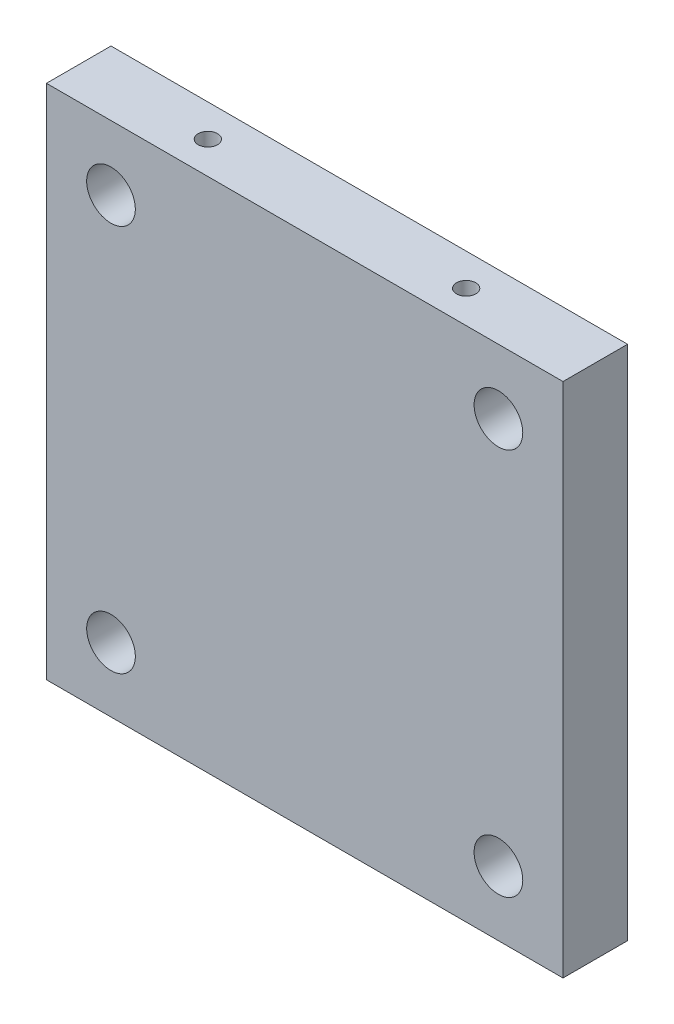
ISO-10303-21;
HEADER;
FILE_DESCRIPTION(('STEP AP214'),'2;1');
FILE_NAME('part.step','',(''),(''),'','','');
FILE_SCHEMA(('AUTOMOTIVE_DESIGN { 1 0 10303 214 1 1 1 1 }'));
ENDSEC;
DATA;
#1=APPLICATION_CONTEXT('core data for automotive mechanical design processes');
#2=APPLICATION_PROTOCOL_DEFINITION('international standard','automotive_design',2000,#1);
#3=PRODUCT_CONTEXT('',#1,'mechanical');
#4=PRODUCT('Part','Part','',(#3));
#5=PRODUCT_RELATED_PRODUCT_CATEGORY('part','',(#4));
#6=PRODUCT_DEFINITION_FORMATION('','',#4);
#7=PRODUCT_DEFINITION_CONTEXT('part definition',#1,'design');
#8=PRODUCT_DEFINITION('design','',#6,#7);
#9=PRODUCT_DEFINITION_SHAPE('','',#8);
#10=(LENGTH_UNIT() NAMED_UNIT(*) SI_UNIT(.MILLI.,.METRE.));
#11=(NAMED_UNIT(*) PLANE_ANGLE_UNIT() SI_UNIT($,.RADIAN.));
#12=(NAMED_UNIT(*) SI_UNIT($,.STERADIAN.) SOLID_ANGLE_UNIT());
#13=UNCERTAINTY_MEASURE_WITH_UNIT(LENGTH_MEASURE(1.E-05),#10,'distance_accuracy_value','');
#14=(GEOMETRIC_REPRESENTATION_CONTEXT(3) GLOBAL_UNCERTAINTY_ASSIGNED_CONTEXT((#13)) GLOBAL_UNIT_ASSIGNED_CONTEXT((#10,
#11,#12)) REPRESENTATION_CONTEXT('',''));
#15=CARTESIAN_POINT('',(0.,0.,0.));
#16=DIRECTION('',(0.,0.,1.));
#17=DIRECTION('',(1.,0.,0.));
#18=AXIS2_PLACEMENT_3D('',#15,#16,#17);
#19=CARTESIAN_POINT('',(-25.4,-38.1,6.35));
#20=DIRECTION('',(0.,-1.,0.));
#21=DIRECTION('',(0.,0.,-1.));
#22=AXIS2_PLACEMENT_3D('',#19,#20,#21);
#23=CONICAL_SURFACE('',#22,1.89864999999999,1.02974425867665);
#24=CARTESIAN_POINT('',(-25.4,-38.1,6.35));
#25=DIRECTION('',(0.,1.,0.));
#26=DIRECTION('',(0.,0.,1.));
#27=AXIS2_PLACEMENT_3D('',#24,#25,#26);
#28=CIRCLE('',#27,1.89865);
#29=CARTESIAN_POINT('',(-25.4,-38.1,8.24865));
#30=VERTEX_POINT('',#29);
#31=EDGE_CURVE('E155',#30,#30,#28,.F.);
#32=ORIENTED_EDGE('',*,*,#31,.T.);
#33=EDGE_LOOP('',(#32));
#34=FACE_BOUND('',#33,.T.);
#35=CARTESIAN_POINT('',(-25.4,-36.9591759856833,6.35));
#36=VERTEX_POINT('',#35);
#37=VERTEX_LOOP('',#36);
#38=FACE_BOUND('',#37,.T.);
#39=ADVANCED_FACE('F16',(#34,#38),#23,.F.);
#40=CARTESIAN_POINT('',(25.4,-38.1,6.35));
#41=DIRECTION('',(0.,-1.,0.));
#42=DIRECTION('',(0.,0.,-1.));
#43=AXIS2_PLACEMENT_3D('',#40,#41,#42);
#44=CONICAL_SURFACE('',#43,1.89865,1.02974425867665);
#45=CARTESIAN_POINT('',(25.4,-36.9591759856833,6.35));
#46=VERTEX_POINT('',#45);
#47=VERTEX_LOOP('',#46);
#48=FACE_BOUND('',#47,.T.);
#49=CARTESIAN_POINT('',(25.4,-38.1,6.35));
#50=DIRECTION('',(0.,-1.,0.));
#51=DIRECTION('',(0.,0.,-1.));
#52=AXIS2_PLACEMENT_3D('',#49,#50,#51);
#53=CIRCLE('',#52,1.89865);
#54=CARTESIAN_POINT('',(25.4,-38.1,4.45135));
#55=VERTEX_POINT('',#54);
#56=EDGE_CURVE('E149',#55,#55,#53,.T.);
#57=ORIENTED_EDGE('',*,*,#56,.T.);
#58=EDGE_LOOP('',(#57));
#59=FACE_BOUND('',#58,.T.);
#60=ADVANCED_FACE('F67',(#48,#59),#44,.F.);
#61=CARTESIAN_POINT('',(-25.4,38.1,6.35));
#62=DIRECTION('',(0.,1.,0.));
#63=DIRECTION('',(0.,0.,1.));
#64=AXIS2_PLACEMENT_3D('',#61,#62,#63);
#65=CONICAL_SURFACE('',#64,1.89865,1.02974425867665);
#66=CARTESIAN_POINT('',(-25.4,36.9591759856833,6.35));
#67=VERTEX_POINT('',#66);
#68=VERTEX_LOOP('',#67);
#69=FACE_BOUND('',#68,.T.);
#70=CARTESIAN_POINT('',(-25.4,38.1,6.35));
#71=DIRECTION('',(0.,1.,0.));
#72=DIRECTION('',(0.,0.,1.));
#73=AXIS2_PLACEMENT_3D('',#70,#71,#72);
#74=CIRCLE('',#73,1.89865);
#75=CARTESIAN_POINT('',(-25.4,38.1,8.24865));
#76=VERTEX_POINT('',#75);
#77=EDGE_CURVE('E147',#76,#76,#74,.T.);
#78=ORIENTED_EDGE('',*,*,#77,.T.);
#79=EDGE_LOOP('',(#78));
#80=FACE_BOUND('',#79,.T.);
#81=ADVANCED_FACE('F73',(#69,#80),#65,.F.);
#82=CARTESIAN_POINT('',(25.4,38.1,6.35));
#83=DIRECTION('',(0.,1.,0.));
#84=DIRECTION('',(0.,0.,1.));
#85=AXIS2_PLACEMENT_3D('',#82,#83,#84);
#86=CONICAL_SURFACE('',#85,1.89864999999999,1.02974425867665);
#87=CARTESIAN_POINT('',(25.4,38.1,6.35));
#88=DIRECTION('',(0.,-1.,0.));
#89=DIRECTION('',(0.,0.,-1.));
#90=AXIS2_PLACEMENT_3D('',#87,#88,#89);
#91=CIRCLE('',#90,1.89865);
#92=CARTESIAN_POINT('',(25.4,38.1,4.45135));
#93=VERTEX_POINT('',#92);
#94=EDGE_CURVE('E148',#93,#93,#91,.F.);
#95=ORIENTED_EDGE('',*,*,#94,.T.);
#96=EDGE_LOOP('',(#95));
#97=FACE_BOUND('',#96,.T.);
#98=CARTESIAN_POINT('',(25.4,36.9591759856833,6.35));
#99=VERTEX_POINT('',#98);
#100=VERTEX_LOOP('',#99);
#101=FACE_BOUND('',#100,.T.);
#102=ADVANCED_FACE('F135',(#97,#101),#86,.F.);
#103=CARTESIAN_POINT('',(-25.4,-36.2671347849675,6.35));
#104=DIRECTION('',(0.,1.,0.));
#105=DIRECTION('',(0.,0.,1.));
#106=AXIS2_PLACEMENT_3D('',#103,#104,#105);
#107=CYLINDRICAL_SURFACE('',#106,1.89865);
#108=CARTESIAN_POINT('',(-25.4,-50.8,6.35));
#109=DIRECTION('',(0.,1.,0.));
#110=DIRECTION('',(0.,0.,1.));
#111=AXIS2_PLACEMENT_3D('',#108,#109,#110);
#112=CIRCLE('',#111,1.89865);
#113=CARTESIAN_POINT('',(-25.4,-50.8,8.24865));
#114=VERTEX_POINT('',#113);
#115=EDGE_CURVE('E19',#114,#114,#112,.T.);
#116=ORIENTED_EDGE('',*,*,#115,.F.);
#117=EDGE_LOOP('',(#116));
#118=FACE_BOUND('',#117,.T.);
#119=ORIENTED_EDGE('',*,*,#31,.F.);
#120=EDGE_LOOP('',(#119));
#121=FACE_BOUND('',#120,.T.);
#122=ADVANCED_FACE('F131',(#118,#121),#107,.F.);
#123=CARTESIAN_POINT('',(25.4,-36.2671347849675,6.35));
#124=DIRECTION('',(0.,-1.,0.));
#125=DIRECTION('',(0.,0.,-1.));
#126=AXIS2_PLACEMENT_3D('',#123,#124,#125);
#127=CYLINDRICAL_SURFACE('',#126,1.89865);
#128=ORIENTED_EDGE('',*,*,#56,.F.);
#129=EDGE_LOOP('',(#128));
#130=FACE_BOUND('',#129,.T.);
#131=CARTESIAN_POINT('',(25.4,-50.8,6.35));
#132=DIRECTION('',(0.,-1.,0.));
#133=DIRECTION('',(0.,0.,-1.));
#134=AXIS2_PLACEMENT_3D('',#131,#132,#133);
#135=CIRCLE('',#134,1.89865);
#136=CARTESIAN_POINT('',(25.4,-50.8,4.45135));
#137=VERTEX_POINT('',#136);
#138=EDGE_CURVE('E187',#137,#137,#135,.F.);
#139=ORIENTED_EDGE('',*,*,#138,.F.);
#140=EDGE_LOOP('',(#139));
#141=FACE_BOUND('',#140,.T.);
#142=ADVANCED_FACE('F127',(#130,#141),#127,.F.);
#143=CARTESIAN_POINT('',(-25.4,36.2671347849675,6.35));
#144=DIRECTION('',(0.,1.,0.));
#145=DIRECTION('',(0.,0.,1.));
#146=AXIS2_PLACEMENT_3D('',#143,#144,#145);
#147=CYLINDRICAL_SURFACE('',#146,1.89865);
#148=ORIENTED_EDGE('',*,*,#77,.F.);
#149=EDGE_LOOP('',(#148));
#150=FACE_BOUND('',#149,.T.);
#151=CARTESIAN_POINT('',(-25.4,50.8,6.35));
#152=DIRECTION('',(0.,1.,0.));
#153=DIRECTION('',(0.,0.,1.));
#154=AXIS2_PLACEMENT_3D('',#151,#152,#153);
#155=CIRCLE('',#154,1.89865);
#156=CARTESIAN_POINT('',(-25.4,50.8,8.24865));
#157=VERTEX_POINT('',#156);
#158=EDGE_CURVE('E185',#157,#157,#155,.F.);
#159=ORIENTED_EDGE('',*,*,#158,.F.);
#160=EDGE_LOOP('',(#159));
#161=FACE_BOUND('',#160,.T.);
#162=ADVANCED_FACE('F123',(#150,#161),#147,.F.);
#163=CARTESIAN_POINT('',(25.4,36.2671347849675,6.35));
#164=DIRECTION('',(0.,-1.,0.));
#165=DIRECTION('',(0.,0.,-1.));
#166=AXIS2_PLACEMENT_3D('',#163,#164,#165);
#167=CYLINDRICAL_SURFACE('',#166,1.89865);
#168=CARTESIAN_POINT('',(25.4,50.8,6.35));
#169=DIRECTION('',(0.,-1.,0.));
#170=DIRECTION('',(0.,0.,-1.));
#171=AXIS2_PLACEMENT_3D('',#168,#169,#170);
#172=CIRCLE('',#171,1.89865);
#173=CARTESIAN_POINT('',(25.4,50.8,4.45135));
#174=VERTEX_POINT('',#173);
#175=EDGE_CURVE('E182',#174,#174,#172,.T.);
#176=ORIENTED_EDGE('',*,*,#175,.F.);
#177=EDGE_LOOP('',(#176));
#178=FACE_BOUND('',#177,.T.);
#179=ORIENTED_EDGE('',*,*,#94,.F.);
#180=EDGE_LOOP('',(#179));
#181=FACE_BOUND('',#180,.T.);
#182=ADVANCED_FACE('F119',(#178,#181),#167,.F.);
#183=CARTESIAN_POINT('',(0.,0.,12.7));
#184=DIRECTION('',(0.,0.,1.));
#185=DIRECTION('',(1.,0.,0.));
#186=AXIS2_PLACEMENT_3D('',#183,#184,#185);
#187=PLANE('',#186);
#188=CARTESIAN_POINT('',(-38.1,-38.1,12.7));
#189=DIRECTION('',(0.,0.,1.));
#190=DIRECTION('',(1.,0.,0.));
#191=AXIS2_PLACEMENT_3D('',#188,#189,#190);
#192=CIRCLE('',#191,4.7879);
#193=CARTESIAN_POINT('',(-33.3121,-38.1,12.7));
#194=VERTEX_POINT('',#193);
#195=EDGE_CURVE('E169',#194,#194,#192,.F.);
#196=ORIENTED_EDGE('',*,*,#195,.T.);
#197=EDGE_LOOP('',(#196));
#198=FACE_BOUND('',#197,.T.);
#199=CARTESIAN_POINT('',(38.1,-38.1,12.7));
#200=DIRECTION('',(0.,0.,1.));
#201=DIRECTION('',(1.,0.,0.));
#202=AXIS2_PLACEMENT_3D('',#199,#200,#201);
#203=CIRCLE('',#202,4.7879);
#204=CARTESIAN_POINT('',(42.8879,-38.1,12.7));
#205=VERTEX_POINT('',#204);
#206=EDGE_CURVE('E173',#205,#205,#203,.F.);
#207=ORIENTED_EDGE('',*,*,#206,.T.);
#208=EDGE_LOOP('',(#207));
#209=FACE_BOUND('',#208,.T.);
#210=CARTESIAN_POINT('',(38.1,38.1,12.7));
#211=DIRECTION('',(0.,0.,1.));
#212=DIRECTION('',(1.,0.,0.));
#213=AXIS2_PLACEMENT_3D('',#210,#211,#212);
#214=CIRCLE('',#213,4.7879);
#215=CARTESIAN_POINT('',(42.8879,38.1,12.7));
#216=VERTEX_POINT('',#215);
#217=EDGE_CURVE('E176',#216,#216,#214,.F.);
#218=ORIENTED_EDGE('',*,*,#217,.T.);
#219=EDGE_LOOP('',(#218));
#220=FACE_BOUND('',#219,.T.);
#221=CARTESIAN_POINT('',(-38.1,38.1,12.7));
#222=DIRECTION('',(0.,0.,1.));
#223=DIRECTION('',(1.,0.,0.));
#224=AXIS2_PLACEMENT_3D('',#221,#222,#223);
#225=CIRCLE('',#224,4.7879);
#226=CARTESIAN_POINT('',(-33.3121,38.1,12.7));
#227=VERTEX_POINT('',#226);
#228=EDGE_CURVE('E179',#227,#227,#225,.F.);
#229=ORIENTED_EDGE('',*,*,#228,.T.);
#230=EDGE_LOOP('',(#229));
#231=FACE_BOUND('',#230,.T.);
#232=DIRECTION('',(1.,0.,0.));
#233=VECTOR('',#232,1.);
#234=CARTESIAN_POINT('',(50.8,50.8,12.7));
#235=LINE('',#234,#233);
#236=CARTESIAN_POINT('',(-50.8,50.8,12.7));
#237=VERTEX_POINT('',#236);
#238=CARTESIAN_POINT('',(50.8,50.8,12.7));
#239=VERTEX_POINT('',#238);
#240=EDGE_CURVE('E213',#237,#239,#235,.T.);
#241=ORIENTED_EDGE('',*,*,#240,.F.);
#242=DIRECTION('',(0.,1.,0.));
#243=VECTOR('',#242,1.);
#244=CARTESIAN_POINT('',(-50.8,50.8,12.7));
#245=LINE('',#244,#243);
#246=CARTESIAN_POINT('',(-50.8,-50.8,12.7));
#247=VERTEX_POINT('',#246);
#248=EDGE_CURVE('E152',#247,#237,#245,.T.);
#249=ORIENTED_EDGE('',*,*,#248,.F.);
#250=DIRECTION('',(1.,0.,0.));
#251=VECTOR('',#250,1.);
#252=CARTESIAN_POINT('',(-50.8,-50.8,12.7));
#253=LINE('',#252,#251);
#254=CARTESIAN_POINT('',(50.8,-50.8,12.7));
#255=VERTEX_POINT('',#254);
#256=EDGE_CURVE('E197',#255,#247,#253,.F.);
#257=ORIENTED_EDGE('',*,*,#256,.F.);
#258=DIRECTION('',(0.,1.,0.));
#259=VECTOR('',#258,1.);
#260=CARTESIAN_POINT('',(50.8,-50.8,12.7));
#261=LINE('',#260,#259);
#262=EDGE_CURVE('E189',#239,#255,#261,.F.);
#263=ORIENTED_EDGE('',*,*,#262,.F.);
#264=EDGE_LOOP('',(#241,#249,#257,#263));
#265=FACE_BOUND('',#264,.T.);
#266=ADVANCED_FACE('F115',(#198,#209,#220,#231,#265),#187,.T.);
#267=CARTESIAN_POINT('',(-50.8,50.8,0.));
#268=DIRECTION('',(-1.,0.,0.));
#269=DIRECTION('',(0.,0.,1.));
#270=AXIS2_PLACEMENT_3D('',#267,#268,#269);
#271=PLANE('',#270);
#272=DIRECTION('',(0.,0.,1.));
#273=VECTOR('',#272,1.);
#274=CARTESIAN_POINT('',(-50.8,50.8,0.));
#275=LINE('',#274,#273);
#276=CARTESIAN_POINT('',(-50.8,50.8,0.));
#277=VERTEX_POINT('',#276);
#278=EDGE_CURVE('E209',#277,#237,#275,.T.);
#279=ORIENTED_EDGE('',*,*,#278,.F.);
#280=DIRECTION('',(0.,1.,0.));
#281=VECTOR('',#280,1.);
#282=CARTESIAN_POINT('',(-50.8,0.,0.));
#283=LINE('',#282,#281);
#284=CARTESIAN_POINT('',(-50.8,-50.8,0.));
#285=VERTEX_POINT('',#284);
#286=EDGE_CURVE('E172',#277,#285,#283,.F.);
#287=ORIENTED_EDGE('',*,*,#286,.T.);
#288=DIRECTION('',(0.,0.,-1.));
#289=VECTOR('',#288,1.);
#290=CARTESIAN_POINT('',(-50.8,-50.8,0.));
#291=LINE('',#290,#289);
#292=EDGE_CURVE('E194',#247,#285,#291,.T.);
#293=ORIENTED_EDGE('',*,*,#292,.F.);
#294=ORIENTED_EDGE('',*,*,#248,.T.);
#295=EDGE_LOOP('',(#279,#287,#293,#294));
#296=FACE_BOUND('',#295,.T.);
#297=ADVANCED_FACE('F111',(#296),#271,.T.);
#298=CARTESIAN_POINT('',(-50.8,-50.8,0.));
#299=DIRECTION('',(0.,-1.,0.));
#300=DIRECTION('',(0.,0.,-1.));
#301=AXIS2_PLACEMENT_3D('',#298,#299,#300);
#302=PLANE('',#301);
#303=ORIENTED_EDGE('',*,*,#138,.T.);
#304=EDGE_LOOP('',(#303));
#305=FACE_BOUND('',#304,.T.);
#306=ORIENTED_EDGE('',*,*,#115,.T.);
#307=EDGE_LOOP('',(#306));
#308=FACE_BOUND('',#307,.T.);
#309=ORIENTED_EDGE('',*,*,#292,.T.);
#310=DIRECTION('',(1.,0.,0.));
#311=VECTOR('',#310,1.);
#312=CARTESIAN_POINT('',(0.,-50.8,0.));
#313=LINE('',#312,#311);
#314=CARTESIAN_POINT('',(50.8,-50.8,0.));
#315=VERTEX_POINT('',#314);
#316=EDGE_CURVE('E224',#285,#315,#313,.T.);
#317=ORIENTED_EDGE('',*,*,#316,.T.);
#318=DIRECTION('',(0.,0.,-1.));
#319=VECTOR('',#318,1.);
#320=CARTESIAN_POINT('',(50.8,-50.8,0.));
#321=LINE('',#320,#319);
#322=EDGE_CURVE('E191',#255,#315,#321,.T.);
#323=ORIENTED_EDGE('',*,*,#322,.F.);
#324=ORIENTED_EDGE('',*,*,#256,.T.);
#325=EDGE_LOOP('',(#309,#317,#323,#324));
#326=FACE_BOUND('',#325,.T.);
#327=ADVANCED_FACE('F107',(#305,#308,#326),#302,.T.);
#328=CARTESIAN_POINT('',(50.8,-50.8,0.));
#329=DIRECTION('',(1.,0.,0.));
#330=DIRECTION('',(0.,0.,-1.));
#331=AXIS2_PLACEMENT_3D('',#328,#329,#330);
#332=PLANE('',#331);
#333=ORIENTED_EDGE('',*,*,#322,.T.);
#334=DIRECTION('',(0.,1.,0.));
#335=VECTOR('',#334,1.);
#336=CARTESIAN_POINT('',(50.8,0.,0.));
#337=LINE('',#336,#335);
#338=CARTESIAN_POINT('',(50.8,50.8,0.));
#339=VERTEX_POINT('',#338);
#340=EDGE_CURVE('E222',#315,#339,#337,.T.);
#341=ORIENTED_EDGE('',*,*,#340,.T.);
#342=DIRECTION('',(0.,0.,1.));
#343=VECTOR('',#342,1.);
#344=CARTESIAN_POINT('',(50.8,50.8,0.));
#345=LINE('',#344,#343);
#346=EDGE_CURVE('E34',#239,#339,#345,.F.);
#347=ORIENTED_EDGE('',*,*,#346,.F.);
#348=ORIENTED_EDGE('',*,*,#262,.T.);
#349=EDGE_LOOP('',(#333,#341,#347,#348));
#350=FACE_BOUND('',#349,.T.);
#351=ADVANCED_FACE('F103',(#350),#332,.T.);
#352=CARTESIAN_POINT('',(50.8,50.8,0.));
#353=DIRECTION('',(0.,1.,0.));
#354=DIRECTION('',(0.,0.,1.));
#355=AXIS2_PLACEMENT_3D('',#352,#353,#354);
#356=PLANE('',#355);
#357=ORIENTED_EDGE('',*,*,#175,.T.);
#358=EDGE_LOOP('',(#357));
#359=FACE_BOUND('',#358,.T.);
#360=ORIENTED_EDGE('',*,*,#158,.T.);
#361=EDGE_LOOP('',(#360));
#362=FACE_BOUND('',#361,.T.);
#363=ORIENTED_EDGE('',*,*,#346,.T.);
#364=DIRECTION('',(1.,0.,0.));
#365=VECTOR('',#364,1.);
#366=CARTESIAN_POINT('',(0.,50.8,0.));
#367=LINE('',#366,#365);
#368=EDGE_CURVE('E168',#339,#277,#367,.F.);
#369=ORIENTED_EDGE('',*,*,#368,.T.);
#370=ORIENTED_EDGE('',*,*,#278,.T.);
#371=ORIENTED_EDGE('',*,*,#240,.T.);
#372=EDGE_LOOP('',(#363,#369,#370,#371));
#373=FACE_BOUND('',#372,.T.);
#374=ADVANCED_FACE('F99',(#359,#362,#373),#356,.T.);
#375=CARTESIAN_POINT('',(-38.1,38.1,12.7));
#376=DIRECTION('',(0.,0.,1.));
#377=DIRECTION('',(1.,0.,0.));
#378=AXIS2_PLACEMENT_3D('',#375,#376,#377);
#379=CYLINDRICAL_SURFACE('',#378,4.7879);
#380=ORIENTED_EDGE('',*,*,#228,.F.);
#381=EDGE_LOOP('',(#380));
#382=FACE_BOUND('',#381,.T.);
#383=CARTESIAN_POINT('',(-38.1,38.1,0.));
#384=DIRECTION('',(0.,0.,1.));
#385=DIRECTION('',(1.,0.,0.));
#386=AXIS2_PLACEMENT_3D('',#383,#384,#385);
#387=CIRCLE('',#386,4.7879);
#388=CARTESIAN_POINT('',(-33.3121,38.1,0.));
#389=VERTEX_POINT('',#388);
#390=EDGE_CURVE('E165',#389,#389,#387,.F.);
#391=ORIENTED_EDGE('',*,*,#390,.T.);
#392=EDGE_LOOP('',(#391));
#393=FACE_BOUND('',#392,.T.);
#394=ADVANCED_FACE('F95',(#382,#393),#379,.F.);
#395=CARTESIAN_POINT('',(38.1,38.1,12.7));
#396=DIRECTION('',(0.,0.,1.));
#397=DIRECTION('',(1.,0.,0.));
#398=AXIS2_PLACEMENT_3D('',#395,#396,#397);
#399=CYLINDRICAL_SURFACE('',#398,4.7879);
#400=ORIENTED_EDGE('',*,*,#217,.F.);
#401=EDGE_LOOP('',(#400));
#402=FACE_BOUND('',#401,.T.);
#403=CARTESIAN_POINT('',(38.1,38.1,0.));
#404=DIRECTION('',(0.,0.,1.));
#405=DIRECTION('',(1.,0.,0.));
#406=AXIS2_PLACEMENT_3D('',#403,#404,#405);
#407=CIRCLE('',#406,4.7879);
#408=CARTESIAN_POINT('',(42.8879,38.1,0.));
#409=VERTEX_POINT('',#408);
#410=EDGE_CURVE('E162',#409,#409,#407,.F.);
#411=ORIENTED_EDGE('',*,*,#410,.T.);
#412=EDGE_LOOP('',(#411));
#413=FACE_BOUND('',#412,.T.);
#414=ADVANCED_FACE('F91',(#402,#413),#399,.F.);
#415=CARTESIAN_POINT('',(38.1,-38.1,12.7));
#416=DIRECTION('',(0.,0.,1.));
#417=DIRECTION('',(1.,0.,0.));
#418=AXIS2_PLACEMENT_3D('',#415,#416,#417);
#419=CYLINDRICAL_SURFACE('',#418,4.7879);
#420=ORIENTED_EDGE('',*,*,#206,.F.);
#421=EDGE_LOOP('',(#420));
#422=FACE_BOUND('',#421,.T.);
#423=CARTESIAN_POINT('',(38.1,-38.1,0.));
#424=DIRECTION('',(0.,0.,1.));
#425=DIRECTION('',(1.,0.,0.));
#426=AXIS2_PLACEMENT_3D('',#423,#424,#425);
#427=CIRCLE('',#426,4.7879);
#428=CARTESIAN_POINT('',(42.8879,-38.1,0.));
#429=VERTEX_POINT('',#428);
#430=EDGE_CURVE('E25',#429,#429,#427,.F.);
#431=ORIENTED_EDGE('',*,*,#430,.T.);
#432=EDGE_LOOP('',(#431));
#433=FACE_BOUND('',#432,.T.);
#434=ADVANCED_FACE('F83',(#422,#433),#419,.F.);
#435=CARTESIAN_POINT('',(-38.1,-38.1,12.7));
#436=DIRECTION('',(0.,0.,1.));
#437=DIRECTION('',(1.,0.,0.));
#438=AXIS2_PLACEMENT_3D('',#435,#436,#437);
#439=CYLINDRICAL_SURFACE('',#438,4.7879);
#440=ORIENTED_EDGE('',*,*,#195,.F.);
#441=EDGE_LOOP('',(#440));
#442=FACE_BOUND('',#441,.T.);
#443=CARTESIAN_POINT('',(-38.1,-38.1,0.));
#444=DIRECTION('',(0.,0.,1.));
#445=DIRECTION('',(1.,0.,0.));
#446=AXIS2_PLACEMENT_3D('',#443,#444,#445);
#447=CIRCLE('',#446,4.7879);
#448=CARTESIAN_POINT('',(-33.3121,-38.1,0.));
#449=VERTEX_POINT('',#448);
#450=EDGE_CURVE('E11',#449,#449,#447,.F.);
#451=ORIENTED_EDGE('',*,*,#450,.T.);
#452=EDGE_LOOP('',(#451));
#453=FACE_BOUND('',#452,.T.);
#454=ADVANCED_FACE('F77',(#442,#453),#439,.F.);
#455=CARTESIAN_POINT('',(0.,0.,0.));
#456=DIRECTION('',(0.,0.,1.));
#457=DIRECTION('',(1.,0.,0.));
#458=AXIS2_PLACEMENT_3D('',#455,#456,#457);
#459=PLANE('',#458);
#460=ORIENTED_EDGE('',*,*,#450,.F.);
#461=EDGE_LOOP('',(#460));
#462=FACE_BOUND('',#461,.T.);
#463=ORIENTED_EDGE('',*,*,#430,.F.);
#464=EDGE_LOOP('',(#463));
#465=FACE_BOUND('',#464,.T.);
#466=ORIENTED_EDGE('',*,*,#410,.F.);
#467=EDGE_LOOP('',(#466));
#468=FACE_BOUND('',#467,.T.);
#469=ORIENTED_EDGE('',*,*,#390,.F.);
#470=EDGE_LOOP('',(#469));
#471=FACE_BOUND('',#470,.T.);
#472=ORIENTED_EDGE('',*,*,#340,.F.);
#473=ORIENTED_EDGE('',*,*,#316,.F.);
#474=ORIENTED_EDGE('',*,*,#286,.F.);
#475=ORIENTED_EDGE('',*,*,#368,.F.);
#476=EDGE_LOOP('',(#472,#473,#474,#475));
#477=FACE_BOUND('',#476,.T.);
#478=ADVANCED_FACE('F75',(#462,#465,#468,#471,#477),#459,.F.);
#479=CLOSED_SHELL('',(#39,#60,#81,#102,#122,#142,#162,#182,#266,#297,#327,#351,#374,#394,#414,
#434,#454,#478));
#480=MANIFOLD_SOLID_BREP('B1',#479);
#481=ADVANCED_BREP_SHAPE_REPRESENTATION('',(#18,#480),#14);
#482=SHAPE_DEFINITION_REPRESENTATION(#9,#481);
ENDSEC;
END-ISO-10303-21;
